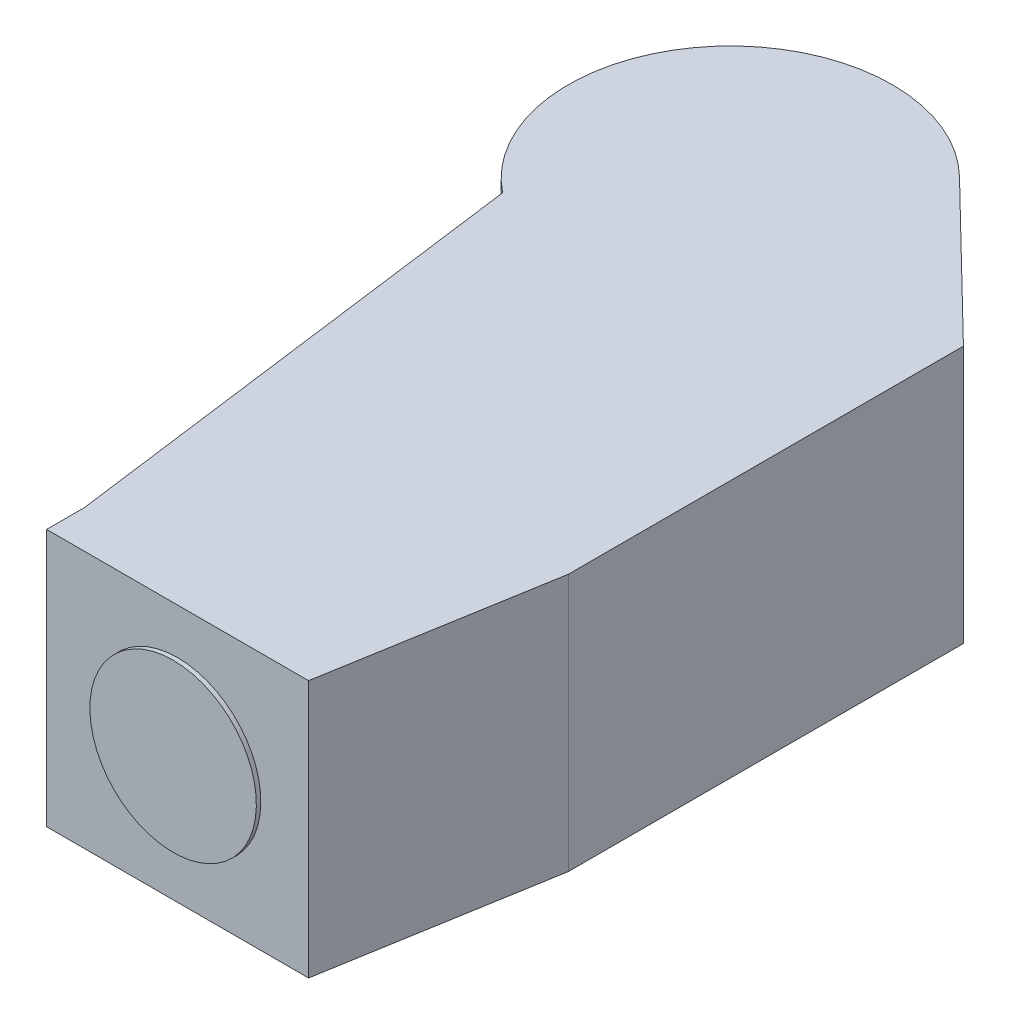
ISO-10303-21;
HEADER;
FILE_DESCRIPTION(('STEP AP214'),'2;1');
FILE_NAME('part.step','',(''),(''),'','','');
FILE_SCHEMA(('AUTOMOTIVE_DESIGN { 1 0 10303 214 1 1 1 1 }'));
ENDSEC;
DATA;
#1=APPLICATION_CONTEXT('core data for automotive mechanical design processes');
#2=APPLICATION_PROTOCOL_DEFINITION('international standard','automotive_design',2000,#1);
#3=PRODUCT_CONTEXT('',#1,'mechanical');
#4=PRODUCT('Part','Part','',(#3));
#5=PRODUCT_RELATED_PRODUCT_CATEGORY('part','',(#4));
#6=PRODUCT_DEFINITION_FORMATION('','',#4);
#7=PRODUCT_DEFINITION_CONTEXT('part definition',#1,'design');
#8=PRODUCT_DEFINITION('design','',#6,#7);
#9=PRODUCT_DEFINITION_SHAPE('','',#8);
#10=(LENGTH_UNIT() NAMED_UNIT(*) SI_UNIT(.MILLI.,.METRE.));
#11=(NAMED_UNIT(*) PLANE_ANGLE_UNIT() SI_UNIT($,.RADIAN.));
#12=(NAMED_UNIT(*) SI_UNIT($,.STERADIAN.) SOLID_ANGLE_UNIT());
#13=UNCERTAINTY_MEASURE_WITH_UNIT(LENGTH_MEASURE(1.E-05),#10,'distance_accuracy_value','');
#14=(GEOMETRIC_REPRESENTATION_CONTEXT(3) GLOBAL_UNCERTAINTY_ASSIGNED_CONTEXT((#13)) GLOBAL_UNIT_ASSIGNED_CONTEXT((#10,
#11,#12)) REPRESENTATION_CONTEXT('',''));
#15=CARTESIAN_POINT('',(0.,0.,0.));
#16=DIRECTION('',(0.,0.,1.));
#17=DIRECTION('',(1.,0.,0.));
#18=AXIS2_PLACEMENT_3D('',#15,#16,#17);
#19=CARTESIAN_POINT('',(59.0000000000002,-57.9999999999998,-2.0000000000002));
#20=DIRECTION('',(-0.985855846669817,0.,-0.167595493933869));
#21=DIRECTION('',(0.167595493933869,0.,-0.985855846669817));
#22=AXIS2_PLACEMENT_3D('',#19,#20,#21);
#23=PLANE('',#22);
#24=DIRECTION('',(-0.167595493933869,0.,0.985855846669817));
#25=VECTOR('',#24,1.);
#26=CARTESIAN_POINT('',(58.9999999999998,58.0000000000002,-1.9999999999998));
#27=LINE('',#26,#25);
#28=CARTESIAN_POINT('',(75.9999999999998,58.0000000000006,-102.));
#29=VERTEX_POINT('',#28);
#30=CARTESIAN_POINT('',(58.9999999999998,58.0000000000002,-1.9999999999998));
#31=VERTEX_POINT('',#30);
#32=EDGE_CURVE('E140',#29,#31,#27,.T.);
#33=ORIENTED_EDGE('',*,*,#32,.T.);
#34=DIRECTION('',(0.,1.,0.));
#35=VECTOR('',#34,1.);
#36=CARTESIAN_POINT('',(59.0000000000002,-57.9999999999998,-2.0000000000002));
#37=LINE('',#36,#35);
#38=CARTESIAN_POINT('',(59.0000000000002,-57.9999999999998,-2.0000000000002));
#39=VERTEX_POINT('',#38);
#40=EDGE_CURVE('E45',#39,#31,#37,.T.);
#41=ORIENTED_EDGE('',*,*,#40,.F.);
#42=DIRECTION('',(-0.167595493933869,0.,0.985855846669817));
#43=VECTOR('',#42,1.);
#44=CARTESIAN_POINT('',(59.0000000000002,-57.9999999999998,-2.0000000000002));
#45=LINE('',#44,#43);
#46=CARTESIAN_POINT('',(76.0000000000002,-57.9999999999994,-102.));
#47=VERTEX_POINT('',#46);
#48=EDGE_CURVE('E160',#47,#39,#45,.T.);
#49=ORIENTED_EDGE('',*,*,#48,.F.);
#50=DIRECTION('',(0.,1.,0.));
#51=VECTOR('',#50,1.);
#52=CARTESIAN_POINT('',(76.0000000000002,-57.9999999999994,-102.));
#53=LINE('',#52,#51);
#54=EDGE_CURVE('E136',#47,#29,#53,.T.);
#55=ORIENTED_EDGE('',*,*,#54,.T.);
#56=EDGE_LOOP('',(#33,#41,#49,#55));
#57=FACE_BOUND('',#56,.T.);
#58=ADVANCED_FACE('F42',(#57),#23,.F.);
#59=CARTESIAN_POINT('',(-41.9999999999998,-58.0000000000001,-2.0000000000002));
#60=DIRECTION('',(0.,0.,-1.));
#61=DIRECTION('',(0.,-1.,0.));
#62=AXIS2_PLACEMENT_3D('',#59,#60,#61);
#63=PLANE('',#62);
#64=CARTESIAN_POINT('',(0.,0.,-2.));
#65=DIRECTION('',(0.,0.,1.));
#66=DIRECTION('',(0.,1.,0.));
#67=AXIS2_PLACEMENT_3D('',#64,#65,#66);
#68=CIRCLE('',#67,37.5);
#69=CARTESIAN_POINT('',(-1.30930550206618E-13,37.5,-1.99999999999987));
#70=VERTEX_POINT('',#69);
#71=EDGE_CURVE('E11',#70,#70,#68,.T.);
#72=ORIENTED_EDGE('',*,*,#71,.F.);
#73=EDGE_LOOP('',(#72));
#74=FACE_BOUND('',#73,.T.);
#75=DIRECTION('',(-1.,0.,0.));
#76=VECTOR('',#75,1.);
#77=CARTESIAN_POINT('',(-42.0000000000002,57.9999999999999,-1.9999999999998));
#78=LINE('',#77,#76);
#79=CARTESIAN_POINT('',(-59.0000000000002,57.9999999999998,-1.9999999999998));
#80=VERTEX_POINT('',#79);
#81=EDGE_CURVE('E144',#31,#80,#78,.T.);
#82=ORIENTED_EDGE('',*,*,#81,.T.);
#83=DIRECTION('',(0.,1.,0.));
#84=VECTOR('',#83,1.);
#85=CARTESIAN_POINT('',(-58.9999999999998,-58.0000000000002,-2.0000000000002));
#86=LINE('',#85,#84);
#87=CARTESIAN_POINT('',(-58.9999999999998,-58.0000000000002,-2.0000000000002));
#88=VERTEX_POINT('',#87);
#89=EDGE_CURVE('E170',#88,#80,#86,.T.);
#90=ORIENTED_EDGE('',*,*,#89,.F.);
#91=DIRECTION('',(-1.,0.,0.));
#92=VECTOR('',#91,1.);
#93=CARTESIAN_POINT('',(-41.9999999999998,-58.0000000000001,-2.0000000000002));
#94=LINE('',#93,#92);
#95=EDGE_CURVE('E101',#39,#88,#94,.T.);
#96=ORIENTED_EDGE('',*,*,#95,.F.);
#97=ORIENTED_EDGE('',*,*,#40,.T.);
#98=EDGE_LOOP('',(#82,#90,#96,#97));
#99=FACE_BOUND('',#98,.T.);
#100=ADVANCED_FACE('F180',(#74,#99),#63,.F.);
#101=CARTESIAN_POINT('',(-58.9999999999998,-58.0000000000002,-2.0000000000002));
#102=DIRECTION('',(1.,0.,0.));
#103=DIRECTION('',(0.,0.,1.));
#104=AXIS2_PLACEMENT_3D('',#101,#102,#103);
#105=PLANE('',#104);
#106=DIRECTION('',(0.,0.,-1.));
#107=VECTOR('',#106,1.);
#108=CARTESIAN_POINT('',(-59.0000000000002,57.9999999999998,-1.9999999999998));
#109=LINE('',#108,#107);
#110=CARTESIAN_POINT('',(-59.0000000000002,57.9999999999999,-18.9999999999998));
#111=VERTEX_POINT('',#110);
#112=EDGE_CURVE('E148',#80,#111,#109,.T.);
#113=ORIENTED_EDGE('',*,*,#112,.T.);
#114=DIRECTION('',(0.,1.,0.));
#115=VECTOR('',#114,1.);
#116=CARTESIAN_POINT('',(-58.9999999999998,-58.0000000000001,-19.0000000000002));
#117=LINE('',#116,#115);
#118=CARTESIAN_POINT('',(-58.9999999999998,-58.0000000000001,-19.0000000000002));
#119=VERTEX_POINT('',#118);
#120=EDGE_CURVE('E167',#119,#111,#117,.T.);
#121=ORIENTED_EDGE('',*,*,#120,.F.);
#122=DIRECTION('',(0.,0.,-1.));
#123=VECTOR('',#122,1.);
#124=CARTESIAN_POINT('',(-58.9999999999998,-58.0000000000002,-2.0000000000002));
#125=LINE('',#124,#123);
#126=EDGE_CURVE('E192',#88,#119,#125,.T.);
#127=ORIENTED_EDGE('',*,*,#126,.F.);
#128=ORIENTED_EDGE('',*,*,#89,.T.);
#129=EDGE_LOOP('',(#113,#121,#127,#128));
#130=FACE_BOUND('',#129,.T.);
#131=ADVANCED_FACE('F188',(#130),#105,.F.);
#132=CARTESIAN_POINT('',(-58.9999999999998,-58.0000000000001,-19.0000000000002));
#133=DIRECTION('',(0.991422127874872,0.,-0.130698754240664));
#134=DIRECTION('',(0.130698754240664,0.,0.991422127874872));
#135=AXIS2_PLACEMENT_3D('',#132,#133,#134);
#136=PLANE('',#135);
#137=DIRECTION('',(-0.130698754240664,0.,-0.991422127874872));
#138=VECTOR('',#137,1.);
#139=CARTESIAN_POINT('',(-59.0000000000002,57.9999999999999,-18.9999999999998));
#140=LINE('',#139,#138);
#141=CARTESIAN_POINT('',(-87.6070170039657,58.0000000000005,-236.));
#142=VERTEX_POINT('',#141);
#143=EDGE_CURVE('E151',#111,#142,#140,.T.);
#144=ORIENTED_EDGE('',*,*,#143,.T.);
#145=DIRECTION('',(0.,1.,0.));
#146=VECTOR('',#145,1.);
#147=CARTESIAN_POINT('',(-87.6070170039653,-57.9999999999995,-236.));
#148=LINE('',#147,#146);
#149=CARTESIAN_POINT('',(-87.6070170039653,-57.9999999999995,-236.));
#150=VERTEX_POINT('',#149);
#151=EDGE_CURVE('E128',#150,#142,#148,.T.);
#152=ORIENTED_EDGE('',*,*,#151,.F.);
#153=DIRECTION('',(-0.130698754240664,0.,-0.991422127874872));
#154=VECTOR('',#153,1.);
#155=CARTESIAN_POINT('',(-58.9999999999998,-58.0000000000001,-19.0000000000002));
#156=LINE('',#155,#154);
#157=EDGE_CURVE('E117',#119,#150,#156,.T.);
#158=ORIENTED_EDGE('',*,*,#157,.F.);
#159=ORIENTED_EDGE('',*,*,#120,.T.);
#160=EDGE_LOOP('',(#144,#152,#158,#159));
#161=FACE_BOUND('',#160,.T.);
#162=ADVANCED_FACE('F190',(#161),#136,.F.);
#163=CARTESIAN_POINT('',(-41.9999999999998,-57.9999999999991,-293.));
#164=DIRECTION('',(0.,1.,0.));
#165=DIRECTION('',(0.,0.,-1.));
#166=AXIS2_PLACEMENT_3D('',#163,#164,#165);
#167=CYLINDRICAL_SURFACE('',#166,73.);
#168=CARTESIAN_POINT('',(-42.0000000000002,58.0000000000009,-293.));
#169=DIRECTION('',(0.,-1.,0.));
#170=DIRECTION('',(0.,0.,1.));
#171=AXIS2_PLACEMENT_3D('',#168,#169,#170);
#172=CIRCLE('',#171,73.);
#173=CARTESIAN_POINT('',(8.92342366951319,58.0000000000012,-345.30492253866));
#174=VERTEX_POINT('',#173);
#175=EDGE_CURVE('E126',#142,#174,#172,.T.);
#176=ORIENTED_EDGE('',*,*,#175,.T.);
#177=DIRECTION('',(0.,1.,0.));
#178=VECTOR('',#177,1.);
#179=CARTESIAN_POINT('',(8.92342366951359,-57.9999999999988,-345.30492253866));
#180=LINE('',#179,#178);
#181=CARTESIAN_POINT('',(8.92342366951359,-57.9999999999988,-345.30492253866));
#182=VERTEX_POINT('',#181);
#183=EDGE_CURVE('E123',#182,#174,#180,.T.);
#184=ORIENTED_EDGE('',*,*,#183,.F.);
#185=CARTESIAN_POINT('',(-41.9999999999998,-57.9999999999991,-293.));
#186=DIRECTION('',(0.,-1.,0.));
#187=DIRECTION('',(0.,0.,1.));
#188=AXIS2_PLACEMENT_3D('',#185,#186,#187);
#189=CIRCLE('',#188,73.);
#190=EDGE_CURVE('E111',#150,#182,#189,.T.);
#191=ORIENTED_EDGE('',*,*,#190,.F.);
#192=ORIENTED_EDGE('',*,*,#151,.T.);
#193=EDGE_LOOP('',(#176,#184,#191,#192));
#194=FACE_BOUND('',#193,.T.);
#195=ADVANCED_FACE('F124',(#194),#167,.T.);
#196=CARTESIAN_POINT('',(76.0000000000002,-57.9999999999988,-280.));
#197=DIRECTION('',(-0.697581146157718,0.,0.716505788200824));
#198=DIRECTION('',(-0.716505788200824,0.,-0.697581146157718));
#199=AXIS2_PLACEMENT_3D('',#196,#197,#198);
#200=PLANE('',#199);
#201=DIRECTION('',(0.716505788200824,0.,0.697581146157718));
#202=VECTOR('',#201,1.);
#203=CARTESIAN_POINT('',(75.9999999999998,58.0000000000012,-280.));
#204=LINE('',#203,#202);
#205=CARTESIAN_POINT('',(75.9999999999998,58.0000000000012,-280.));
#206=VERTEX_POINT('',#205);
#207=EDGE_CURVE('E86',#174,#206,#204,.T.);
#208=ORIENTED_EDGE('',*,*,#207,.T.);
#209=DIRECTION('',(0.,1.,0.));
#210=VECTOR('',#209,1.);
#211=CARTESIAN_POINT('',(76.0000000000002,-57.9999999999988,-280.));
#212=LINE('',#211,#210);
#213=CARTESIAN_POINT('',(76.0000000000002,-57.9999999999988,-280.));
#214=VERTEX_POINT('',#213);
#215=EDGE_CURVE('E129',#214,#206,#212,.T.);
#216=ORIENTED_EDGE('',*,*,#215,.F.);
#217=DIRECTION('',(0.716505788200824,0.,0.697581146157718));
#218=VECTOR('',#217,1.);
#219=CARTESIAN_POINT('',(76.0000000000002,-57.9999999999988,-280.));
#220=LINE('',#219,#218);
#221=EDGE_CURVE('E115',#182,#214,#220,.T.);
#222=ORIENTED_EDGE('',*,*,#221,.F.);
#223=ORIENTED_EDGE('',*,*,#183,.T.);
#224=EDGE_LOOP('',(#208,#216,#222,#223));
#225=FACE_BOUND('',#224,.T.);
#226=ADVANCED_FACE('F131',(#225),#200,.F.);
#227=CARTESIAN_POINT('',(76.0000000000002,-57.9999999999994,-102.));
#228=DIRECTION('',(-1.,0.,0.));
#229=DIRECTION('',(0.,0.,-1.));
#230=AXIS2_PLACEMENT_3D('',#227,#228,#229);
#231=PLANE('',#230);
#232=DIRECTION('',(0.,0.,1.));
#233=VECTOR('',#232,1.);
#234=CARTESIAN_POINT('',(75.9999999999998,58.0000000000006,-102.));
#235=LINE('',#234,#233);
#236=EDGE_CURVE('E92',#206,#29,#235,.T.);
#237=ORIENTED_EDGE('',*,*,#236,.T.);
#238=ORIENTED_EDGE('',*,*,#54,.F.);
#239=DIRECTION('',(0.,0.,1.));
#240=VECTOR('',#239,1.);
#241=CARTESIAN_POINT('',(76.0000000000002,-57.9999999999994,-102.));
#242=LINE('',#241,#240);
#243=EDGE_CURVE('E60',#214,#47,#242,.T.);
#244=ORIENTED_EDGE('',*,*,#243,.F.);
#245=ORIENTED_EDGE('',*,*,#215,.T.);
#246=EDGE_LOOP('',(#237,#238,#244,#245));
#247=FACE_BOUND('',#246,.T.);
#248=ADVANCED_FACE('F227',(#247),#231,.F.);
#249=CARTESIAN_POINT('',(-41.9999999999998,-57.9999999999991,-293.));
#250=DIRECTION('',(0.,-1.,0.));
#251=DIRECTION('',(0.,0.,1.));
#252=AXIS2_PLACEMENT_3D('',#249,#250,#251);
#253=PLANE('',#252);
#254=ORIENTED_EDGE('',*,*,#48,.T.);
#255=ORIENTED_EDGE('',*,*,#95,.T.);
#256=ORIENTED_EDGE('',*,*,#126,.T.);
#257=ORIENTED_EDGE('',*,*,#157,.T.);
#258=ORIENTED_EDGE('',*,*,#190,.T.);
#259=ORIENTED_EDGE('',*,*,#221,.T.);
#260=ORIENTED_EDGE('',*,*,#243,.T.);
#261=EDGE_LOOP('',(#254,#255,#256,#257,#258,#259,#260));
#262=FACE_BOUND('',#261,.T.);
#263=ADVANCED_FACE('F113',(#262),#253,.T.);
#264=CARTESIAN_POINT('',(-42.0000000000002,58.0000000000009,-293.));
#265=DIRECTION('',(0.,-1.,0.));
#266=DIRECTION('',(0.,0.,1.));
#267=AXIS2_PLACEMENT_3D('',#264,#265,#266);
#268=PLANE('',#267);
#269=ORIENTED_EDGE('',*,*,#32,.F.);
#270=ORIENTED_EDGE('',*,*,#236,.F.);
#271=ORIENTED_EDGE('',*,*,#207,.F.);
#272=ORIENTED_EDGE('',*,*,#175,.F.);
#273=ORIENTED_EDGE('',*,*,#143,.F.);
#274=ORIENTED_EDGE('',*,*,#112,.F.);
#275=ORIENTED_EDGE('',*,*,#81,.F.);
#276=EDGE_LOOP('',(#269,#270,#271,#272,#273,#274,#275));
#277=FACE_BOUND('',#276,.T.);
#278=ADVANCED_FACE('F185',(#277),#268,.F.);
#279=CARTESIAN_POINT('',(0.,0.,0.));
#280=DIRECTION('',(0.,0.,-1.));
#281=DIRECTION('',(0.,-1.,0.));
#282=AXIS2_PLACEMENT_3D('',#279,#280,#281);
#283=CYLINDRICAL_SURFACE('',#282,37.5);
#284=CARTESIAN_POINT('',(0.,0.,0.));
#285=DIRECTION('',(0.,0.,1.));
#286=DIRECTION('',(0.,1.,0.));
#287=AXIS2_PLACEMENT_3D('',#284,#285,#286);
#288=CIRCLE('',#287,37.5);
#289=CARTESIAN_POINT('',(-1.30930550206618E-13,37.5,1.30930550206618E-13));
#290=VERTEX_POINT('',#289);
#291=EDGE_CURVE('E145',#290,#290,#288,.T.);
#292=ORIENTED_EDGE('',*,*,#291,.F.);
#293=EDGE_LOOP('',(#292));
#294=FACE_BOUND('',#293,.T.);
#295=ORIENTED_EDGE('',*,*,#71,.T.);
#296=EDGE_LOOP('',(#295));
#297=FACE_BOUND('',#296,.T.);
#298=ADVANCED_FACE('F208',(#294,#297),#283,.T.);
#299=CARTESIAN_POINT('',(0.,0.,0.));
#300=DIRECTION('',(0.,0.,1.));
#301=DIRECTION('',(0.,1.,0.));
#302=AXIS2_PLACEMENT_3D('',#299,#300,#301);
#303=PLANE('',#302);
#304=ORIENTED_EDGE('',*,*,#291,.T.);
#305=EDGE_LOOP('',(#304));
#306=FACE_BOUND('',#305,.T.);
#307=ADVANCED_FACE('F206',(#306),#303,.T.);
#308=CLOSED_SHELL('',(#58,#100,#131,#162,#195,#226,#248,#263,#278,#298,#307));
#309=MANIFOLD_SOLID_BREP('B2',#308);
#310=ADVANCED_BREP_SHAPE_REPRESENTATION('',(#18,#309),#14);
#311=SHAPE_DEFINITION_REPRESENTATION(#9,#310);
ENDSEC;
END-ISO-10303-21;
